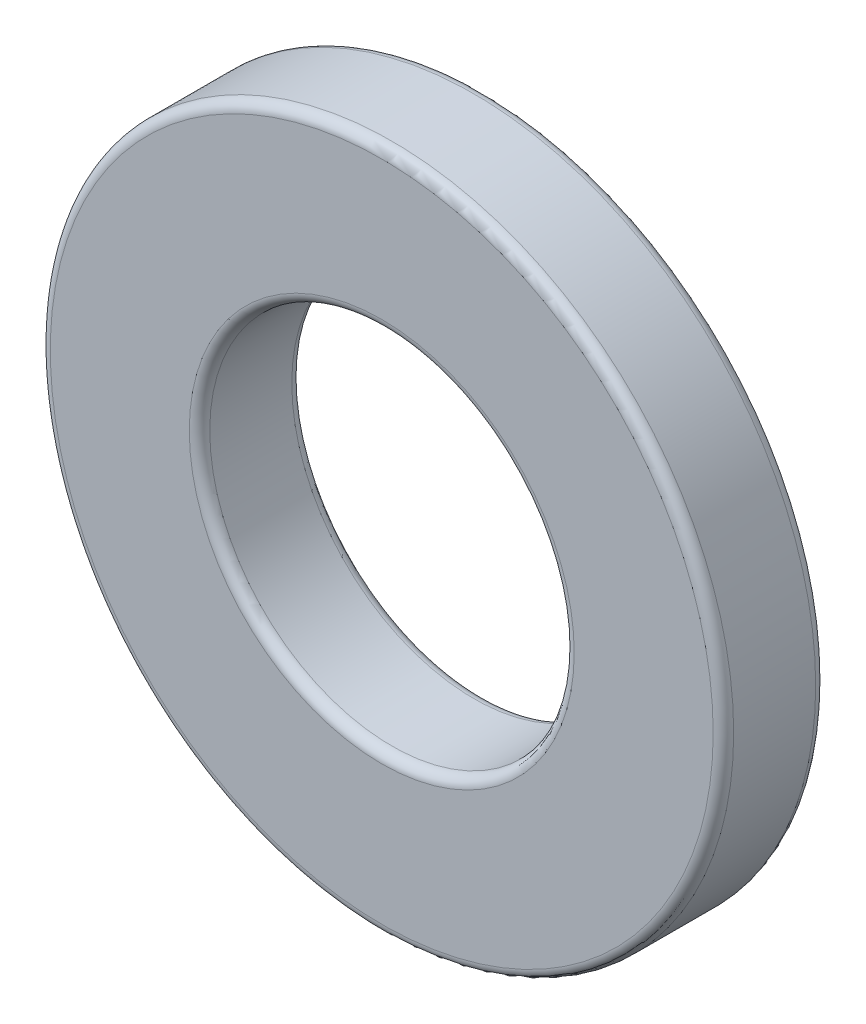
ISO-10303-21;
HEADER;
FILE_DESCRIPTION(('STEP AP214'),'2;1');
FILE_NAME('part.step','',(''),(''),'','','');
FILE_SCHEMA(('AUTOMOTIVE_DESIGN { 1 0 10303 214 1 1 1 1 }'));
ENDSEC;
DATA;
#1=APPLICATION_CONTEXT('core data for automotive mechanical design processes');
#2=APPLICATION_PROTOCOL_DEFINITION('international standard','automotive_design',2000,#1);
#3=PRODUCT_CONTEXT('',#1,'mechanical');
#4=PRODUCT('Part','Part','',(#3));
#5=PRODUCT_RELATED_PRODUCT_CATEGORY('part','',(#4));
#6=PRODUCT_DEFINITION_FORMATION('','',#4);
#7=PRODUCT_DEFINITION_CONTEXT('part definition',#1,'design');
#8=PRODUCT_DEFINITION('design','',#6,#7);
#9=PRODUCT_DEFINITION_SHAPE('','',#8);
#10=(LENGTH_UNIT() NAMED_UNIT(*) SI_UNIT(.MILLI.,.METRE.));
#11=(NAMED_UNIT(*) PLANE_ANGLE_UNIT() SI_UNIT($,.RADIAN.));
#12=(NAMED_UNIT(*) SI_UNIT($,.STERADIAN.) SOLID_ANGLE_UNIT());
#13=UNCERTAINTY_MEASURE_WITH_UNIT(LENGTH_MEASURE(1.E-05),#10,'distance_accuracy_value','');
#14=(GEOMETRIC_REPRESENTATION_CONTEXT(3) GLOBAL_UNCERTAINTY_ASSIGNED_CONTEXT((#13)) GLOBAL_UNIT_ASSIGNED_CONTEXT((#10,
#11,#12)) REPRESENTATION_CONTEXT('',''));
#15=CARTESIAN_POINT('',(0.,0.,0.));
#16=DIRECTION('',(0.,0.,1.));
#17=DIRECTION('',(1.,0.,0.));
#18=AXIS2_PLACEMENT_3D('',#15,#16,#17);
#19=CARTESIAN_POINT('',(0.,0.,-0.899999999999994));
#20=DIRECTION('',(0.,0.,1.));
#21=DIRECTION('',(1.,0.,0.));
#22=AXIS2_PLACEMENT_3D('',#19,#20,#21);
#23=CYLINDRICAL_SURFACE('',#22,6.);
#24=CARTESIAN_POINT('',(0.,0.,-0.719999999999994));
#25=DIRECTION('',(0.,0.,1.));
#26=DIRECTION('',(1.,0.,0.));
#27=AXIS2_PLACEMENT_3D('',#24,#25,#26);
#28=CIRCLE('',#27,6.);
#29=CARTESIAN_POINT('',(6.,0.,-0.719999999999994));
#30=VERTEX_POINT('',#29);
#31=EDGE_CURVE('E73',#30,#30,#28,.T.);
#32=CARTESIAN_POINT('',(0.,0.,0.720000000000006));
#33=DIRECTION('',(0.,0.,1.));
#34=DIRECTION('',(1.,0.,0.));
#35=AXIS2_PLACEMENT_3D('',#32,#33,#34);
#36=CIRCLE('',#35,6.);
#37=CARTESIAN_POINT('',(6.,0.,0.720000000000006));
#38=VERTEX_POINT('',#37);
#39=EDGE_CURVE('E77',#38,#38,#36,.F.);
#40=CARTESIAN_POINT('',(6.,0.,-0.719999999999994));
#41=CARTESIAN_POINT('',(6.,0.,-0.704999999999994));
#42=CARTESIAN_POINT('',(6.,0.,-0.689999999999994));
#43=CARTESIAN_POINT('',(6.,0.,-0.659999999999994));
#44=CARTESIAN_POINT('',(6.,0.,-0.644999999999994));
#45=CARTESIAN_POINT('',(6.,0.,-0.614999999999994));
#46=CARTESIAN_POINT('',(6.,0.,-0.599999999999994));
#47=CARTESIAN_POINT('',(6.,0.,-0.569999999999994));
#48=CARTESIAN_POINT('',(6.,0.,-0.554999999999994));
#49=CARTESIAN_POINT('',(6.,0.,-0.524999999999994));
#50=CARTESIAN_POINT('',(6.,0.,-0.509999999999994));
#51=CARTESIAN_POINT('',(6.,0.,-0.479999999999994));
#52=CARTESIAN_POINT('',(6.,0.,-0.464999999999994));
#53=CARTESIAN_POINT('',(6.,0.,-0.434999999999994));
#54=CARTESIAN_POINT('',(6.,0.,-0.419999999999994));
#55=CARTESIAN_POINT('',(6.,0.,-0.389999999999994));
#56=CARTESIAN_POINT('',(6.,0.,-0.374999999999994));
#57=CARTESIAN_POINT('',(6.,0.,-0.344999999999994));
#58=CARTESIAN_POINT('',(6.,0.,-0.329999999999994));
#59=CARTESIAN_POINT('',(6.,0.,-0.299999999999994));
#60=CARTESIAN_POINT('',(6.,0.,-0.284999999999994));
#61=CARTESIAN_POINT('',(6.,0.,-0.254999999999994));
#62=CARTESIAN_POINT('',(6.,0.,-0.239999999999994));
#63=CARTESIAN_POINT('',(6.,0.,-0.209999999999994));
#64=CARTESIAN_POINT('',(6.,0.,-0.194999999999994));
#65=CARTESIAN_POINT('',(6.,0.,-0.164999999999994));
#66=CARTESIAN_POINT('',(6.,0.,-0.149999999999994));
#67=CARTESIAN_POINT('',(6.,0.,-0.119999999999994));
#68=CARTESIAN_POINT('',(6.,0.,-0.104999999999994));
#69=CARTESIAN_POINT('',(6.,0.,-0.0749999999999941));
#70=CARTESIAN_POINT('',(6.,0.,-0.0599999999999941));
#71=CARTESIAN_POINT('',(6.,0.,-0.0299999999999941));
#72=CARTESIAN_POINT('',(6.,0.,-0.0149999999999941));
#73=CARTESIAN_POINT('',(6.,0.,0.0150000000000059));
#74=CARTESIAN_POINT('',(6.,0.,0.0300000000000059));
#75=CARTESIAN_POINT('',(6.,0.,0.0600000000000059));
#76=CARTESIAN_POINT('',(6.,0.,0.0750000000000059));
#77=CARTESIAN_POINT('',(6.,0.,0.105000000000006));
#78=CARTESIAN_POINT('',(6.,0.,0.120000000000006));
#79=CARTESIAN_POINT('',(6.,0.,0.150000000000006));
#80=CARTESIAN_POINT('',(6.,0.,0.165000000000006));
#81=CARTESIAN_POINT('',(6.,0.,0.195000000000006));
#82=CARTESIAN_POINT('',(6.,0.,0.210000000000006));
#83=CARTESIAN_POINT('',(6.,0.,0.240000000000006));
#84=CARTESIAN_POINT('',(6.,0.,0.255000000000006));
#85=CARTESIAN_POINT('',(6.,0.,0.285000000000006));
#86=CARTESIAN_POINT('',(6.,0.,0.300000000000006));
#87=CARTESIAN_POINT('',(6.,0.,0.330000000000006));
#88=CARTESIAN_POINT('',(6.,0.,0.345000000000006));
#89=CARTESIAN_POINT('',(6.,0.,0.375000000000006));
#90=CARTESIAN_POINT('',(6.,0.,0.390000000000006));
#91=CARTESIAN_POINT('',(6.,0.,0.420000000000006));
#92=CARTESIAN_POINT('',(6.,0.,0.435000000000006));
#93=CARTESIAN_POINT('',(6.,0.,0.465000000000006));
#94=CARTESIAN_POINT('',(6.,0.,0.480000000000006));
#95=CARTESIAN_POINT('',(6.,0.,0.510000000000006));
#96=CARTESIAN_POINT('',(6.,0.,0.525000000000006));
#97=CARTESIAN_POINT('',(6.,0.,0.555000000000006));
#98=CARTESIAN_POINT('',(6.,0.,0.570000000000006));
#99=CARTESIAN_POINT('',(6.,0.,0.600000000000006));
#100=CARTESIAN_POINT('',(6.,0.,0.615000000000006));
#101=CARTESIAN_POINT('',(6.,0.,0.645000000000006));
#102=CARTESIAN_POINT('',(6.,0.,0.660000000000006));
#103=CARTESIAN_POINT('',(6.,0.,0.690000000000006));
#104=CARTESIAN_POINT('',(6.,0.,0.705000000000006));
#105=CARTESIAN_POINT('',(6.,0.,0.720000000000006));
#106=B_SPLINE_CURVE_WITH_KNOTS('',3,(#40,#41,#42,#43,#44,#45,#46,#47,#48,#49,#50,#51,#52,#53,
#54,#55,#56,#57,#58,#59,#60,#61,#62,#63,#64,#65,#66,#67,#68,#69,#70,#71,#72,#73,#74,#75,#76,#77,
#78,#79,#80,#81,#82,#83,#84,#85,#86,#87,#88,#89,#90,#91,#92,#93,#94,#95,#96,#97,#98,#99,#100,
#101,#102,#103,#104,#105),.UNSPECIFIED.,.F.,.F.,(4,2,2,2,2,2,2,2,2,2,2,2,2,2,2,2,2,2,2,2,2,2,2,
2,2,2,2,2,2,2,2,2,4),(0.,0.045,0.0899999999999999,0.135,0.18,0.225,0.27,0.315,0.36,0.405,0.45,
0.495,0.54,0.585,0.63,0.675,0.72,0.765,0.81,0.855,0.899999999999999,0.945,0.99,1.035,1.08,1.125,
1.17,1.215,1.26,1.305,1.35,1.395,1.44),.UNSPECIFIED.);
#107=EDGE_CURVE('BSEAM39',#30,#38,#106,.T.);
#108=ORIENTED_EDGE('',*,*,#31,.T.);
#109=ORIENTED_EDGE('',*,*,#39,.T.);
#110=ORIENTED_EDGE('',*,*,#107,.T.);
#111=ORIENTED_EDGE('',*,*,#107,.F.);
#112=EDGE_LOOP('',(#108,#110,#109,#111));
#113=FACE_BOUND('',#112,.T.);
#114=ADVANCED_FACE('F39',(#113),#23,.T.);
#115=CARTESIAN_POINT('',(0.,0.,-0.899999999999994));
#116=DIRECTION('',(0.,0.,1.));
#117=DIRECTION('',(1.,0.,0.));
#118=AXIS2_PLACEMENT_3D('',#115,#116,#117);
#119=PLANE('',#118);
#120=CARTESIAN_POINT('',(0.,0.,-0.899999999999994));
#121=DIRECTION('',(0.,0.,1.));
#122=DIRECTION('',(1.,0.,0.));
#123=AXIS2_PLACEMENT_3D('',#120,#121,#122);
#124=CIRCLE('',#123,5.82);
#125=CARTESIAN_POINT('',(5.82,0.,-0.899999999999994));
#126=VERTEX_POINT('',#125);
#127=EDGE_CURVE('E65',#126,#126,#124,.F.);
#128=ORIENTED_EDGE('',*,*,#127,.T.);
#129=EDGE_LOOP('',(#128));
#130=FACE_BOUND('',#129,.T.);
#131=CARTESIAN_POINT('',(0.,0.,-0.899999999999994));
#132=DIRECTION('',(0.,0.,1.));
#133=DIRECTION('',(1.,0.,0.));
#134=AXIS2_PLACEMENT_3D('',#131,#132,#133);
#135=CIRCLE('',#134,3.38);
#136=CARTESIAN_POINT('',(3.38,0.,-0.899999999999994));
#137=VERTEX_POINT('',#136);
#138=EDGE_CURVE('E69',#137,#137,#135,.T.);
#139=ORIENTED_EDGE('',*,*,#138,.T.);
#140=EDGE_LOOP('',(#139));
#141=FACE_BOUND('',#140,.T.);
#142=ADVANCED_FACE('F93',(#130,#141),#119,.F.);
#143=CARTESIAN_POINT('',(0.,0.,-0.899999999999994));
#144=DIRECTION('',(0.,0.,1.));
#145=DIRECTION('',(1.,0.,0.));
#146=AXIS2_PLACEMENT_3D('',#143,#144,#145);
#147=CYLINDRICAL_SURFACE('',#146,3.2);
#148=CARTESIAN_POINT('',(0.,0.,-0.719999999999994));
#149=DIRECTION('',(0.,0.,1.));
#150=DIRECTION('',(1.,0.,0.));
#151=AXIS2_PLACEMENT_3D('',#148,#149,#150);
#152=CIRCLE('',#151,3.2);
#153=CARTESIAN_POINT('',(3.2,0.,-0.719999999999994));
#154=VERTEX_POINT('',#153);
#155=EDGE_CURVE('E53',#154,#154,#152,.F.);
#156=CARTESIAN_POINT('',(0.,0.,0.720000000000006));
#157=DIRECTION('',(0.,0.,1.));
#158=DIRECTION('',(1.,0.,0.));
#159=AXIS2_PLACEMENT_3D('',#156,#157,#158);
#160=CIRCLE('',#159,3.2);
#161=CARTESIAN_POINT('',(3.2,0.,0.720000000000006));
#162=VERTEX_POINT('',#161);
#163=EDGE_CURVE('E59',#162,#162,#160,.T.);
#164=CARTESIAN_POINT('',(3.2,0.,-0.719999999999994));
#165=CARTESIAN_POINT('',(3.2,0.,-0.704999999999994));
#166=CARTESIAN_POINT('',(3.2,0.,-0.689999999999994));
#167=CARTESIAN_POINT('',(3.2,0.,-0.659999999999994));
#168=CARTESIAN_POINT('',(3.2,0.,-0.644999999999994));
#169=CARTESIAN_POINT('',(3.2,0.,-0.614999999999994));
#170=CARTESIAN_POINT('',(3.2,0.,-0.599999999999994));
#171=CARTESIAN_POINT('',(3.2,0.,-0.569999999999994));
#172=CARTESIAN_POINT('',(3.2,0.,-0.554999999999994));
#173=CARTESIAN_POINT('',(3.2,0.,-0.524999999999994));
#174=CARTESIAN_POINT('',(3.2,0.,-0.509999999999994));
#175=CARTESIAN_POINT('',(3.2,0.,-0.479999999999994));
#176=CARTESIAN_POINT('',(3.2,0.,-0.464999999999994));
#177=CARTESIAN_POINT('',(3.2,0.,-0.434999999999994));
#178=CARTESIAN_POINT('',(3.2,0.,-0.419999999999994));
#179=CARTESIAN_POINT('',(3.2,0.,-0.389999999999994));
#180=CARTESIAN_POINT('',(3.2,0.,-0.374999999999994));
#181=CARTESIAN_POINT('',(3.2,0.,-0.344999999999994));
#182=CARTESIAN_POINT('',(3.2,0.,-0.329999999999994));
#183=CARTESIAN_POINT('',(3.2,0.,-0.299999999999994));
#184=CARTESIAN_POINT('',(3.2,0.,-0.284999999999994));
#185=CARTESIAN_POINT('',(3.2,0.,-0.254999999999994));
#186=CARTESIAN_POINT('',(3.2,0.,-0.239999999999994));
#187=CARTESIAN_POINT('',(3.2,0.,-0.209999999999994));
#188=CARTESIAN_POINT('',(3.2,0.,-0.194999999999994));
#189=CARTESIAN_POINT('',(3.2,0.,-0.164999999999994));
#190=CARTESIAN_POINT('',(3.2,0.,-0.149999999999994));
#191=CARTESIAN_POINT('',(3.2,0.,-0.119999999999994));
#192=CARTESIAN_POINT('',(3.2,0.,-0.104999999999994));
#193=CARTESIAN_POINT('',(3.2,0.,-0.0749999999999941));
#194=CARTESIAN_POINT('',(3.2,0.,-0.0599999999999941));
#195=CARTESIAN_POINT('',(3.2,0.,-0.0299999999999941));
#196=CARTESIAN_POINT('',(3.2,0.,-0.0149999999999941));
#197=CARTESIAN_POINT('',(3.2,0.,0.0150000000000059));
#198=CARTESIAN_POINT('',(3.2,0.,0.0300000000000059));
#199=CARTESIAN_POINT('',(3.2,0.,0.0600000000000059));
#200=CARTESIAN_POINT('',(3.2,0.,0.0750000000000059));
#201=CARTESIAN_POINT('',(3.2,0.,0.105000000000006));
#202=CARTESIAN_POINT('',(3.2,0.,0.120000000000006));
#203=CARTESIAN_POINT('',(3.2,0.,0.150000000000006));
#204=CARTESIAN_POINT('',(3.2,0.,0.165000000000006));
#205=CARTESIAN_POINT('',(3.2,0.,0.195000000000006));
#206=CARTESIAN_POINT('',(3.2,0.,0.210000000000006));
#207=CARTESIAN_POINT('',(3.2,0.,0.240000000000006));
#208=CARTESIAN_POINT('',(3.2,0.,0.255000000000006));
#209=CARTESIAN_POINT('',(3.2,0.,0.285000000000006));
#210=CARTESIAN_POINT('',(3.2,0.,0.300000000000006));
#211=CARTESIAN_POINT('',(3.2,0.,0.330000000000006));
#212=CARTESIAN_POINT('',(3.2,0.,0.345000000000006));
#213=CARTESIAN_POINT('',(3.2,0.,0.375000000000006));
#214=CARTESIAN_POINT('',(3.2,0.,0.390000000000006));
#215=CARTESIAN_POINT('',(3.2,0.,0.420000000000006));
#216=CARTESIAN_POINT('',(3.2,0.,0.435000000000006));
#217=CARTESIAN_POINT('',(3.2,0.,0.465000000000006));
#218=CARTESIAN_POINT('',(3.2,0.,0.480000000000006));
#219=CARTESIAN_POINT('',(3.2,0.,0.510000000000006));
#220=CARTESIAN_POINT('',(3.2,0.,0.525000000000006));
#221=CARTESIAN_POINT('',(3.2,0.,0.555000000000006));
#222=CARTESIAN_POINT('',(3.2,0.,0.570000000000006));
#223=CARTESIAN_POINT('',(3.2,0.,0.600000000000006));
#224=CARTESIAN_POINT('',(3.2,0.,0.615000000000006));
#225=CARTESIAN_POINT('',(3.2,0.,0.645000000000006));
#226=CARTESIAN_POINT('',(3.2,0.,0.660000000000006));
#227=CARTESIAN_POINT('',(3.2,0.,0.690000000000006));
#228=CARTESIAN_POINT('',(3.2,0.,0.705000000000006));
#229=CARTESIAN_POINT('',(3.2,0.,0.720000000000006));
#230=B_SPLINE_CURVE_WITH_KNOTS('',3,(#164,#165,#166,#167,#168,#169,#170,#171,#172,#173,#174,
#175,#176,#177,#178,#179,#180,#181,#182,#183,#184,#185,#186,#187,#188,#189,#190,#191,#192,#193,
#194,#195,#196,#197,#198,#199,#200,#201,#202,#203,#204,#205,#206,#207,#208,#209,#210,#211,#212,
#213,#214,#215,#216,#217,#218,#219,#220,#221,#222,#223,#224,#225,#226,#227,#228,#229),
.UNSPECIFIED.,.F.,.F.,(4,2,2,2,2,2,2,2,2,2,2,2,2,2,2,2,2,2,2,2,2,2,2,2,2,2,2,2,2,2,2,2,4),(0.,
0.045,0.0899999999999999,0.135,0.18,0.225,0.27,0.315,0.36,0.405,0.45,0.495,0.54,0.585,0.63,
0.675,0.72,0.765,0.81,0.855,0.899999999999999,0.945,0.99,1.035,1.08,1.125,1.17,1.215,1.26,1.305,
1.35,1.395,1.44),.UNSPECIFIED.);
#231=EDGE_CURVE('BSEAM99',#154,#162,#230,.T.);
#232=ORIENTED_EDGE('',*,*,#155,.T.);
#233=ORIENTED_EDGE('',*,*,#163,.T.);
#234=ORIENTED_EDGE('',*,*,#231,.T.);
#235=ORIENTED_EDGE('',*,*,#231,.F.);
#236=EDGE_LOOP('',(#232,#234,#233,#235));
#237=FACE_BOUND('',#236,.T.);
#238=ADVANCED_FACE('F99',(#237),#147,.F.);
#239=CARTESIAN_POINT('',(0.,0.,0.900000000000006));
#240=DIRECTION('',(0.,0.,1.));
#241=DIRECTION('',(1.,0.,0.));
#242=AXIS2_PLACEMENT_3D('',#239,#240,#241);
#243=PLANE('',#242);
#244=CARTESIAN_POINT('',(0.,0.,0.900000000000006));
#245=DIRECTION('',(0.,0.,1.));
#246=DIRECTION('',(1.,0.,0.));
#247=AXIS2_PLACEMENT_3D('',#244,#245,#246);
#248=CIRCLE('',#247,3.38);
#249=CARTESIAN_POINT('',(3.38,0.,0.900000000000006));
#250=VERTEX_POINT('',#249);
#251=EDGE_CURVE('E10',#250,#250,#248,.F.);
#252=ORIENTED_EDGE('',*,*,#251,.T.);
#253=EDGE_LOOP('',(#252));
#254=FACE_BOUND('',#253,.T.);
#255=CARTESIAN_POINT('',(0.,0.,0.900000000000006));
#256=DIRECTION('',(0.,0.,1.));
#257=DIRECTION('',(1.,0.,0.));
#258=AXIS2_PLACEMENT_3D('',#255,#256,#257);
#259=CIRCLE('',#258,5.82);
#260=CARTESIAN_POINT('',(5.82,0.,0.900000000000006));
#261=VERTEX_POINT('',#260);
#262=EDGE_CURVE('E47',#261,#261,#259,.T.);
#263=ORIENTED_EDGE('',*,*,#262,.T.);
#264=EDGE_LOOP('',(#263));
#265=FACE_BOUND('',#264,.T.);
#266=ADVANCED_FACE('F107',(#254,#265),#243,.T.);
#267=CARTESIAN_POINT('',(0.,0.,-0.719999999999994));
#268=DIRECTION('',(0.,0.,1.));
#269=DIRECTION('',(1.,0.,0.));
#270=AXIS2_PLACEMENT_3D('',#267,#268,#269);
#271=TOROIDAL_SURFACE('',#270,5.82,0.18);
#272=ORIENTED_EDGE('',*,*,#127,.F.);
#273=EDGE_LOOP('',(#272));
#274=FACE_BOUND('',#273,.T.);
#275=ORIENTED_EDGE('',*,*,#31,.F.);
#276=EDGE_LOOP('',(#275));
#277=FACE_BOUND('',#276,.T.);
#278=ADVANCED_FACE('F104',(#274,#277),#271,.T.);
#279=CARTESIAN_POINT('',(0.,0.,-0.719999999999994));
#280=DIRECTION('',(0.,0.,1.));
#281=DIRECTION('',(1.,0.,0.));
#282=AXIS2_PLACEMENT_3D('',#279,#280,#281);
#283=TOROIDAL_SURFACE('',#282,3.38,0.18);
#284=ORIENTED_EDGE('',*,*,#155,.F.);
#285=EDGE_LOOP('',(#284));
#286=FACE_BOUND('',#285,.T.);
#287=ORIENTED_EDGE('',*,*,#138,.F.);
#288=EDGE_LOOP('',(#287));
#289=FACE_BOUND('',#288,.T.);
#290=ADVANCED_FACE('F90',(#286,#289),#283,.T.);
#291=CARTESIAN_POINT('',(0.,0.,0.720000000000006));
#292=DIRECTION('',(0.,0.,1.));
#293=DIRECTION('',(1.,0.,0.));
#294=AXIS2_PLACEMENT_3D('',#291,#292,#293);
#295=TOROIDAL_SURFACE('',#294,3.38,0.18);
#296=ORIENTED_EDGE('',*,*,#251,.F.);
#297=EDGE_LOOP('',(#296));
#298=FACE_BOUND('',#297,.T.);
#299=ORIENTED_EDGE('',*,*,#163,.F.);
#300=EDGE_LOOP('',(#299));
#301=FACE_BOUND('',#300,.T.);
#302=ADVANCED_FACE('F86',(#298,#301),#295,.T.);
#303=CARTESIAN_POINT('',(0.,0.,0.720000000000006));
#304=DIRECTION('',(0.,0.,1.));
#305=DIRECTION('',(1.,0.,0.));
#306=AXIS2_PLACEMENT_3D('',#303,#304,#305);
#307=TOROIDAL_SURFACE('',#306,5.82,0.18);
#308=ORIENTED_EDGE('',*,*,#39,.F.);
#309=EDGE_LOOP('',(#308));
#310=FACE_BOUND('',#309,.T.);
#311=ORIENTED_EDGE('',*,*,#262,.F.);
#312=EDGE_LOOP('',(#311));
#313=FACE_BOUND('',#312,.T.);
#314=ADVANCED_FACE('F41',(#310,#313),#307,.T.);
#315=CLOSED_SHELL('',(#114,#142,#238,#266,#278,#290,#302,#314));
#316=MANIFOLD_SOLID_BREP('B2',#315);
#317=ADVANCED_BREP_SHAPE_REPRESENTATION('',(#18,#316),#14);
#318=SHAPE_DEFINITION_REPRESENTATION(#9,#317);
ENDSEC;
END-ISO-10303-21;
